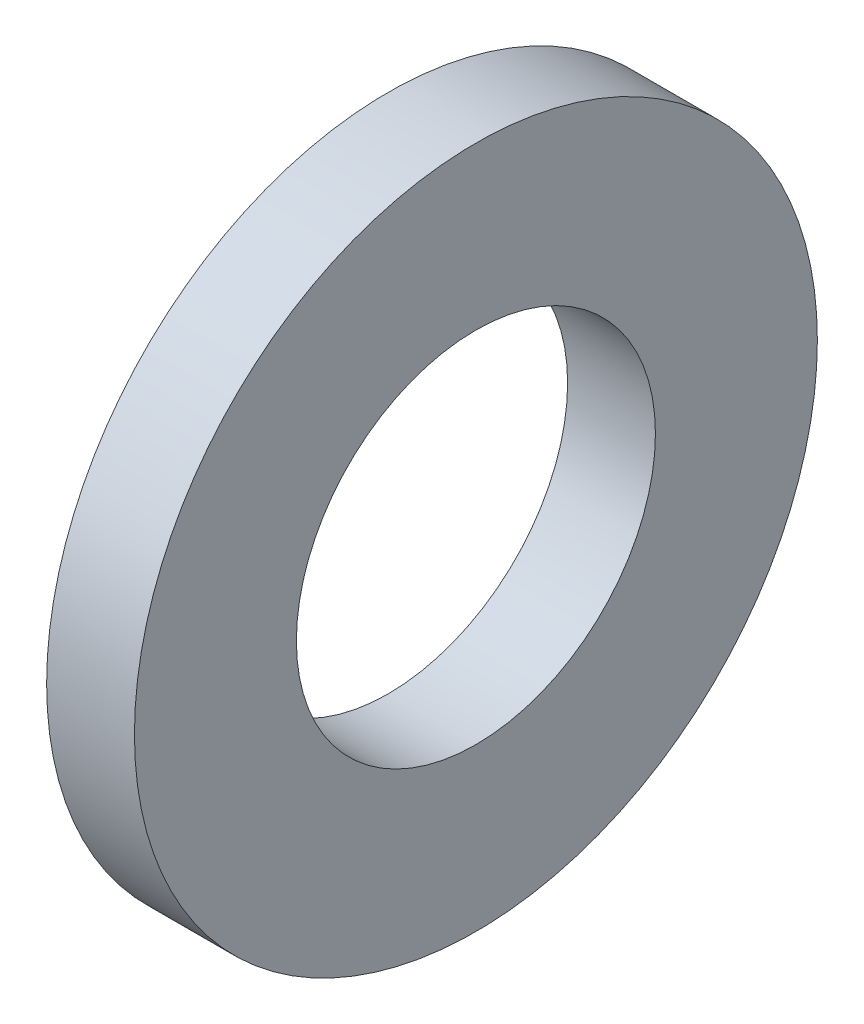
ISO-10303-21;
HEADER;
FILE_DESCRIPTION(('STEP AP214'),'2;1');
FILE_NAME('part.step','',(''),(''),'','','');
FILE_SCHEMA(('AUTOMOTIVE_DESIGN { 1 0 10303 214 1 1 1 1 }'));
ENDSEC;
DATA;
#1=APPLICATION_CONTEXT('core data for automotive mechanical design processes');
#2=APPLICATION_PROTOCOL_DEFINITION('international standard','automotive_design',2000,#1);
#3=PRODUCT_CONTEXT('',#1,'mechanical');
#4=PRODUCT('Part','Part','',(#3));
#5=PRODUCT_RELATED_PRODUCT_CATEGORY('part','',(#4));
#6=PRODUCT_DEFINITION_FORMATION('','',#4);
#7=PRODUCT_DEFINITION_CONTEXT('part definition',#1,'design');
#8=PRODUCT_DEFINITION('design','',#6,#7);
#9=PRODUCT_DEFINITION_SHAPE('','',#8);
#10=(LENGTH_UNIT() NAMED_UNIT(*) SI_UNIT(.MILLI.,.METRE.));
#11=(NAMED_UNIT(*) PLANE_ANGLE_UNIT() SI_UNIT($,.RADIAN.));
#12=(NAMED_UNIT(*) SI_UNIT($,.STERADIAN.) SOLID_ANGLE_UNIT());
#13=UNCERTAINTY_MEASURE_WITH_UNIT(LENGTH_MEASURE(1.E-05),#10,'distance_accuracy_value','');
#14=(GEOMETRIC_REPRESENTATION_CONTEXT(3) GLOBAL_UNCERTAINTY_ASSIGNED_CONTEXT((#13)) GLOBAL_UNIT_ASSIGNED_CONTEXT((#10,
#11,#12)) REPRESENTATION_CONTEXT('',''));
#15=CARTESIAN_POINT('',(0.,0.,0.));
#16=DIRECTION('',(0.,0.,1.));
#17=DIRECTION('',(1.,0.,0.));
#18=AXIS2_PLACEMENT_3D('',#15,#16,#17);
#19=CARTESIAN_POINT('',(-34.9249999999999,0.,0.));
#20=DIRECTION('',(-1.,0.,0.));
#21=DIRECTION('',(0.,0.,1.));
#22=AXIS2_PLACEMENT_3D('',#19,#20,#21);
#23=CYLINDRICAL_SURFACE('',#22,1.84);
#24=CARTESIAN_POINT('',(0.,0.,0.));
#25=DIRECTION('',(-1.,0.,0.));
#26=DIRECTION('',(0.,0.,1.));
#27=AXIS2_PLACEMENT_3D('',#24,#25,#26);
#28=CIRCLE('',#27,1.84);
#29=CARTESIAN_POINT('',(0.,0.,1.84));
#30=VERTEX_POINT('',#29);
#31=EDGE_CURVE('E10',#30,#30,#28,.T.);
#32=ORIENTED_EDGE('',*,*,#31,.F.);
#33=EDGE_LOOP('',(#32));
#34=FACE_BOUND('',#33,.T.);
#35=CARTESIAN_POINT('',(-0.899999999999998,0.,0.));
#36=DIRECTION('',(-1.,0.,0.));
#37=DIRECTION('',(0.,0.,1.));
#38=AXIS2_PLACEMENT_3D('',#35,#36,#37);
#39=CIRCLE('',#38,1.84);
#40=CARTESIAN_POINT('',(-0.899999999999998,0.,1.84));
#41=VERTEX_POINT('',#40);
#42=EDGE_CURVE('E50',#41,#41,#39,.T.);
#43=ORIENTED_EDGE('',*,*,#42,.T.);
#44=EDGE_LOOP('',(#43));
#45=FACE_BOUND('',#44,.T.);
#46=ADVANCED_FACE('F36',(#34,#45),#23,.F.);
#47=CARTESIAN_POINT('',(0.,1.84,0.));
#48=DIRECTION('',(-1.,0.,0.));
#49=DIRECTION('',(0.,0.,1.));
#50=AXIS2_PLACEMENT_3D('',#47,#48,#49);
#51=PLANE('',#50);
#52=CARTESIAN_POINT('',(0.,0.,0.));
#53=DIRECTION('',(-1.,0.,0.));
#54=DIRECTION('',(0.,0.,1.));
#55=AXIS2_PLACEMENT_3D('',#52,#53,#54);
#56=CIRCLE('',#55,3.5);
#57=CARTESIAN_POINT('',(0.,0.,3.5));
#58=VERTEX_POINT('',#57);
#59=EDGE_CURVE('E42',#58,#58,#56,.T.);
#60=ORIENTED_EDGE('',*,*,#59,.F.);
#61=EDGE_LOOP('',(#60));
#62=FACE_BOUND('',#61,.T.);
#63=ORIENTED_EDGE('',*,*,#31,.T.);
#64=EDGE_LOOP('',(#63));
#65=FACE_BOUND('',#64,.T.);
#66=ADVANCED_FACE('F65',(#62,#65),#51,.F.);
#67=CARTESIAN_POINT('',(-34.9249999999999,0.,0.));
#68=DIRECTION('',(-1.,0.,0.));
#69=DIRECTION('',(0.,0.,1.));
#70=AXIS2_PLACEMENT_3D('',#67,#68,#69);
#71=CYLINDRICAL_SURFACE('',#70,3.5);
#72=CARTESIAN_POINT('',(-0.899999999999998,0.,0.));
#73=DIRECTION('',(-1.,0.,0.));
#74=DIRECTION('',(0.,0.,1.));
#75=AXIS2_PLACEMENT_3D('',#72,#73,#74);
#76=CIRCLE('',#75,3.5);
#77=CARTESIAN_POINT('',(-0.899999999999998,0.,3.5));
#78=VERTEX_POINT('',#77);
#79=EDGE_CURVE('E46',#78,#78,#76,.T.);
#80=ORIENTED_EDGE('',*,*,#79,.F.);
#81=EDGE_LOOP('',(#80));
#82=FACE_BOUND('',#81,.T.);
#83=ORIENTED_EDGE('',*,*,#59,.T.);
#84=EDGE_LOOP('',(#83));
#85=FACE_BOUND('',#84,.T.);
#86=ADVANCED_FACE('F60',(#82,#85),#71,.T.);
#87=CARTESIAN_POINT('',(-0.899999999999999,3.5,0.));
#88=DIRECTION('',(1.,0.,0.));
#89=DIRECTION('',(0.,0.,-1.));
#90=AXIS2_PLACEMENT_3D('',#87,#88,#89);
#91=PLANE('',#90);
#92=ORIENTED_EDGE('',*,*,#42,.F.);
#93=EDGE_LOOP('',(#92));
#94=FACE_BOUND('',#93,.T.);
#95=ORIENTED_EDGE('',*,*,#79,.T.);
#96=EDGE_LOOP('',(#95));
#97=FACE_BOUND('',#96,.T.);
#98=ADVANCED_FACE('F57',(#94,#97),#91,.F.);
#99=CLOSED_SHELL('',(#46,#66,#86,#98));
#100=MANIFOLD_SOLID_BREP('B2',#99);
#101=ADVANCED_BREP_SHAPE_REPRESENTATION('',(#18,#100),#14);
#102=SHAPE_DEFINITION_REPRESENTATION(#9,#101);
ENDSEC;
END-ISO-10303-21;
